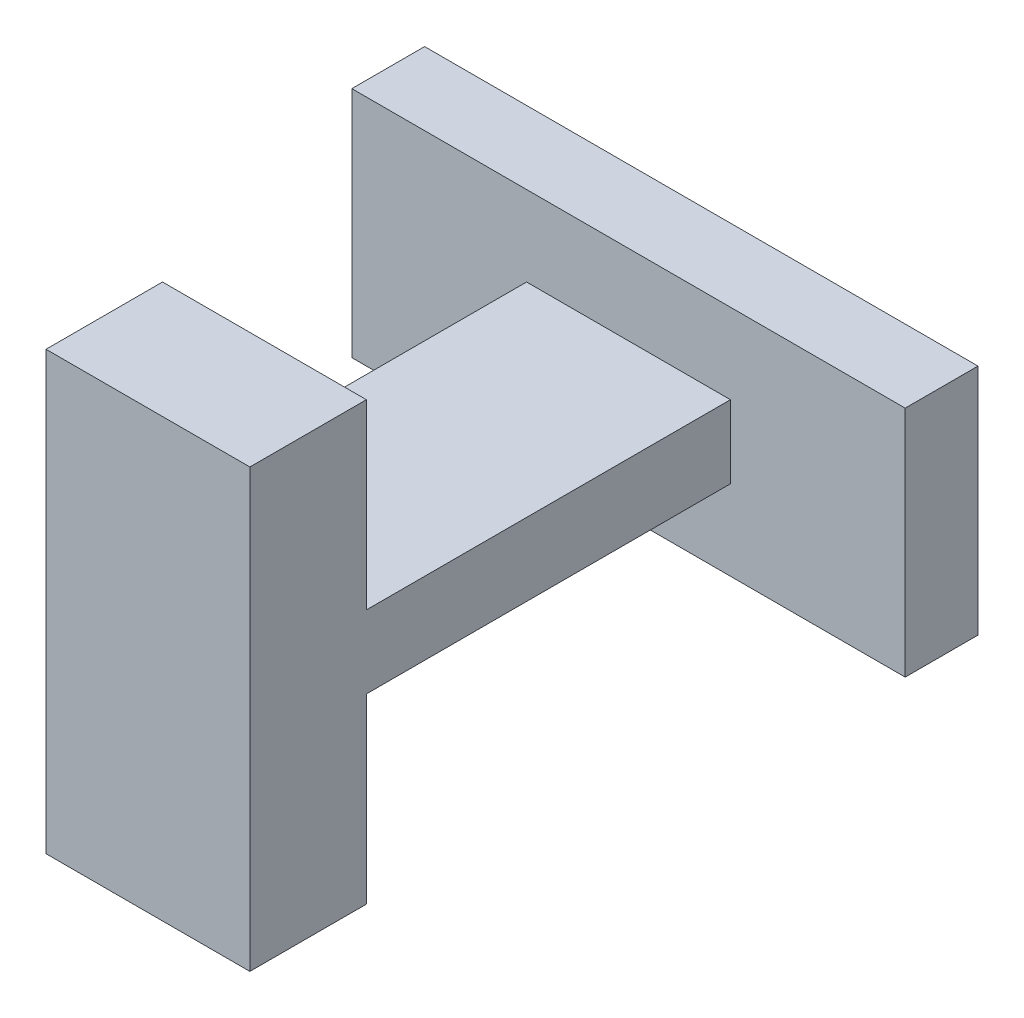
ISO-10303-21;
HEADER;
FILE_DESCRIPTION(('STEP AP214'),'2;1');
FILE_NAME('part.step','',(''),(''),'','','');
FILE_SCHEMA(('AUTOMOTIVE_DESIGN { 1 0 10303 214 1 1 1 1 }'));
ENDSEC;
DATA;
#1=APPLICATION_CONTEXT('core data for automotive mechanical design processes');
#2=APPLICATION_PROTOCOL_DEFINITION('international standard','automotive_design',2000,#1);
#3=PRODUCT_CONTEXT('',#1,'mechanical');
#4=PRODUCT('Part','Part','',(#3));
#5=PRODUCT_RELATED_PRODUCT_CATEGORY('part','',(#4));
#6=PRODUCT_DEFINITION_FORMATION('','',#4);
#7=PRODUCT_DEFINITION_CONTEXT('part definition',#1,'design');
#8=PRODUCT_DEFINITION('design','',#6,#7);
#9=PRODUCT_DEFINITION_SHAPE('','',#8);
#10=(LENGTH_UNIT() NAMED_UNIT(*) SI_UNIT(.MILLI.,.METRE.));
#11=(NAMED_UNIT(*) PLANE_ANGLE_UNIT() SI_UNIT($,.RADIAN.));
#12=(NAMED_UNIT(*) SI_UNIT($,.STERADIAN.) SOLID_ANGLE_UNIT());
#13=UNCERTAINTY_MEASURE_WITH_UNIT(LENGTH_MEASURE(1.E-05),#10,'distance_accuracy_value','');
#14=(GEOMETRIC_REPRESENTATION_CONTEXT(3) GLOBAL_UNCERTAINTY_ASSIGNED_CONTEXT((#13)) GLOBAL_UNIT_ASSIGNED_CONTEXT((#10,
#11,#12)) REPRESENTATION_CONTEXT('',''));
#15=CARTESIAN_POINT('',(0.,0.,0.));
#16=DIRECTION('',(0.,0.,1.));
#17=DIRECTION('',(1.,0.,0.));
#18=AXIS2_PLACEMENT_3D('',#15,#16,#17);
#19=CARTESIAN_POINT('',(0.,0.,5.));
#20=DIRECTION('',(0.,0.,-1.));
#21=DIRECTION('',(-1.,0.,0.));
#22=AXIS2_PLACEMENT_3D('',#19,#20,#21);
#23=PLANE('',#22);
#24=DIRECTION('',(0.,1.,0.));
#25=VECTOR('',#24,1.);
#26=CARTESIAN_POINT('',(19.,-8.,5.));
#27=LINE('',#26,#25);
#28=CARTESIAN_POINT('',(19.,-8.,5.));
#29=VERTEX_POINT('',#28);
#30=CARTESIAN_POINT('',(19.,8.,5.));
#31=VERTEX_POINT('',#30);
#32=EDGE_CURVE('E236',#29,#31,#27,.T.);
#33=ORIENTED_EDGE('',*,*,#32,.T.);
#34=DIRECTION('',(-1.,0.,0.));
#35=VECTOR('',#34,1.);
#36=CARTESIAN_POINT('',(-19.,8.,5.));
#37=LINE('',#36,#35);
#38=CARTESIAN_POINT('',(-19.,8.,5.));
#39=VERTEX_POINT('',#38);
#40=EDGE_CURVE('E247',#31,#39,#37,.T.);
#41=ORIENTED_EDGE('',*,*,#40,.T.);
#42=DIRECTION('',(0.,-1.,0.));
#43=VECTOR('',#42,1.);
#44=CARTESIAN_POINT('',(-19.,-8.,5.));
#45=LINE('',#44,#43);
#46=CARTESIAN_POINT('',(-19.,-8.,5.));
#47=VERTEX_POINT('',#46);
#48=EDGE_CURVE('E245',#39,#47,#45,.T.);
#49=ORIENTED_EDGE('',*,*,#48,.T.);
#50=DIRECTION('',(1.,0.,0.));
#51=VECTOR('',#50,1.);
#52=CARTESIAN_POINT('',(-19.,-8.,5.));
#53=LINE('',#52,#51);
#54=EDGE_CURVE('E233',#47,#29,#53,.T.);
#55=ORIENTED_EDGE('',*,*,#54,.T.);
#56=EDGE_LOOP('',(#33,#41,#49,#55));
#57=FACE_BOUND('',#56,.T.);
#58=DIRECTION('',(0.,1.,0.));
#59=VECTOR('',#58,1.);
#60=CARTESIAN_POINT('',(7.,-2.5,5.));
#61=LINE('',#60,#59);
#62=CARTESIAN_POINT('',(7.,-2.5,5.));
#63=VERTEX_POINT('',#62);
#64=CARTESIAN_POINT('',(7.,2.5,5.));
#65=VERTEX_POINT('',#64);
#66=EDGE_CURVE('E150',#63,#65,#61,.T.);
#67=ORIENTED_EDGE('',*,*,#66,.F.);
#68=DIRECTION('',(1.,0.,0.));
#69=VECTOR('',#68,1.);
#70=CARTESIAN_POINT('',(-7.,-2.5,5.));
#71=LINE('',#70,#69);
#72=CARTESIAN_POINT('',(-7.,-2.5,5.));
#73=VERTEX_POINT('',#72);
#74=EDGE_CURVE('E204',#73,#63,#71,.T.);
#75=ORIENTED_EDGE('',*,*,#74,.F.);
#76=DIRECTION('',(0.,-1.,0.));
#77=VECTOR('',#76,1.);
#78=CARTESIAN_POINT('',(-7.,-2.5,5.));
#79=LINE('',#78,#77);
#80=CARTESIAN_POINT('',(-7.,2.5,5.));
#81=VERTEX_POINT('',#80);
#82=EDGE_CURVE('E56',#81,#73,#79,.T.);
#83=ORIENTED_EDGE('',*,*,#82,.F.);
#84=DIRECTION('',(-1.,0.,0.));
#85=VECTOR('',#84,1.);
#86=CARTESIAN_POINT('',(-7.,2.5,5.));
#87=LINE('',#86,#85);
#88=EDGE_CURVE('E51',#65,#81,#87,.T.);
#89=ORIENTED_EDGE('',*,*,#88,.F.);
#90=EDGE_LOOP('',(#67,#75,#83,#89));
#91=FACE_BOUND('',#90,.T.);
#92=ADVANCED_FACE('F34',(#57,#91),#23,.F.);
#93=CARTESIAN_POINT('',(19.,-8.,5.));
#94=DIRECTION('',(-1.,0.,0.));
#95=DIRECTION('',(0.,0.,1.));
#96=AXIS2_PLACEMENT_3D('',#93,#94,#95);
#97=PLANE('',#96);
#98=DIRECTION('',(0.,1.,0.));
#99=VECTOR('',#98,1.);
#100=CARTESIAN_POINT('',(19.,-8.,0.));
#101=LINE('',#100,#99);
#102=CARTESIAN_POINT('',(19.,-8.,0.));
#103=VERTEX_POINT('',#102);
#104=CARTESIAN_POINT('',(19.,8.,0.));
#105=VERTEX_POINT('',#104);
#106=EDGE_CURVE('E241',#103,#105,#101,.T.);
#107=ORIENTED_EDGE('',*,*,#106,.T.);
#108=DIRECTION('',(0.,0.,-1.));
#109=VECTOR('',#108,1.);
#110=CARTESIAN_POINT('',(19.,8.,5.));
#111=LINE('',#110,#109);
#112=EDGE_CURVE('E11',#31,#105,#111,.T.);
#113=ORIENTED_EDGE('',*,*,#112,.F.);
#114=ORIENTED_EDGE('',*,*,#32,.F.);
#115=DIRECTION('',(0.,0.,-1.));
#116=VECTOR('',#115,1.);
#117=CARTESIAN_POINT('',(19.,-8.,5.));
#118=LINE('',#117,#116);
#119=EDGE_CURVE('E230',#29,#103,#118,.T.);
#120=ORIENTED_EDGE('',*,*,#119,.T.);
#121=EDGE_LOOP('',(#107,#113,#114,#120));
#122=FACE_BOUND('',#121,.T.);
#123=ADVANCED_FACE('F36',(#122),#97,.F.);
#124=CARTESIAN_POINT('',(-19.,8.,5.));
#125=DIRECTION('',(0.,-1.,0.));
#126=DIRECTION('',(0.,0.,-1.));
#127=AXIS2_PLACEMENT_3D('',#124,#125,#126);
#128=PLANE('',#127);
#129=DIRECTION('',(-1.,0.,0.));
#130=VECTOR('',#129,1.);
#131=CARTESIAN_POINT('',(-19.,8.,0.));
#132=LINE('',#131,#130);
#133=CARTESIAN_POINT('',(-19.,8.,0.));
#134=VERTEX_POINT('',#133);
#135=EDGE_CURVE('E239',#105,#134,#132,.T.);
#136=ORIENTED_EDGE('',*,*,#135,.T.);
#137=DIRECTION('',(0.,0.,-1.));
#138=VECTOR('',#137,1.);
#139=CARTESIAN_POINT('',(-19.,8.,5.));
#140=LINE('',#139,#138);
#141=EDGE_CURVE('E43',#39,#134,#140,.T.);
#142=ORIENTED_EDGE('',*,*,#141,.F.);
#143=ORIENTED_EDGE('',*,*,#40,.F.);
#144=ORIENTED_EDGE('',*,*,#112,.T.);
#145=EDGE_LOOP('',(#136,#142,#143,#144));
#146=FACE_BOUND('',#145,.T.);
#147=ADVANCED_FACE('F268',(#146),#128,.F.);
#148=CARTESIAN_POINT('',(-19.,-8.,5.));
#149=DIRECTION('',(1.,0.,0.));
#150=DIRECTION('',(0.,0.,-1.));
#151=AXIS2_PLACEMENT_3D('',#148,#149,#150);
#152=PLANE('',#151);
#153=DIRECTION('',(0.,-1.,0.));
#154=VECTOR('',#153,1.);
#155=CARTESIAN_POINT('',(-19.,-8.,0.));
#156=LINE('',#155,#154);
#157=CARTESIAN_POINT('',(-19.,-8.,0.));
#158=VERTEX_POINT('',#157);
#159=EDGE_CURVE('E237',#134,#158,#156,.T.);
#160=ORIENTED_EDGE('',*,*,#159,.T.);
#161=DIRECTION('',(0.,0.,-1.));
#162=VECTOR('',#161,1.);
#163=CARTESIAN_POINT('',(-19.,-8.,5.));
#164=LINE('',#163,#162);
#165=EDGE_CURVE('E227',#47,#158,#164,.T.);
#166=ORIENTED_EDGE('',*,*,#165,.F.);
#167=ORIENTED_EDGE('',*,*,#48,.F.);
#168=ORIENTED_EDGE('',*,*,#141,.T.);
#169=EDGE_LOOP('',(#160,#166,#167,#168));
#170=FACE_BOUND('',#169,.T.);
#171=ADVANCED_FACE('F280',(#170),#152,.F.);
#172=CARTESIAN_POINT('',(-19.,-8.,5.));
#173=DIRECTION('',(0.,1.,0.));
#174=DIRECTION('',(0.,0.,1.));
#175=AXIS2_PLACEMENT_3D('',#172,#173,#174);
#176=PLANE('',#175);
#177=DIRECTION('',(1.,0.,0.));
#178=VECTOR('',#177,1.);
#179=CARTESIAN_POINT('',(-19.,-8.,0.));
#180=LINE('',#179,#178);
#181=EDGE_CURVE('E234',#158,#103,#180,.T.);
#182=ORIENTED_EDGE('',*,*,#181,.T.);
#183=ORIENTED_EDGE('',*,*,#119,.F.);
#184=ORIENTED_EDGE('',*,*,#54,.F.);
#185=ORIENTED_EDGE('',*,*,#165,.T.);
#186=EDGE_LOOP('',(#182,#183,#184,#185));
#187=FACE_BOUND('',#186,.T.);
#188=ADVANCED_FACE('F276',(#187),#176,.F.);
#189=CARTESIAN_POINT('',(0.,0.,0.));
#190=DIRECTION('',(0.,0.,-1.));
#191=DIRECTION('',(-1.,0.,0.));
#192=AXIS2_PLACEMENT_3D('',#189,#190,#191);
#193=PLANE('',#192);
#194=ORIENTED_EDGE('',*,*,#106,.F.);
#195=ORIENTED_EDGE('',*,*,#181,.F.);
#196=ORIENTED_EDGE('',*,*,#159,.F.);
#197=ORIENTED_EDGE('',*,*,#135,.F.);
#198=EDGE_LOOP('',(#194,#195,#196,#197));
#199=FACE_BOUND('',#198,.T.);
#200=ADVANCED_FACE('F273',(#199),#193,.T.);
#201=CARTESIAN_POINT('',(7.,-2.5,30.));
#202=DIRECTION('',(-1.,0.,0.));
#203=DIRECTION('',(0.,0.,1.));
#204=AXIS2_PLACEMENT_3D('',#201,#202,#203);
#205=PLANE('',#204);
#206=ORIENTED_EDGE('',*,*,#66,.T.);
#207=DIRECTION('',(0.,0.,-1.));
#208=VECTOR('',#207,1.);
#209=CARTESIAN_POINT('',(7.,2.5,30.));
#210=LINE('',#209,#208);
#211=CARTESIAN_POINT('',(7.,2.5,30.));
#212=VERTEX_POINT('',#211);
#213=EDGE_CURVE('E223',#212,#65,#210,.T.);
#214=ORIENTED_EDGE('',*,*,#213,.F.);
#215=DIRECTION('',(0.,1.,0.));
#216=VECTOR('',#215,1.);
#217=CARTESIAN_POINT('',(7.,-15.,30.));
#218=LINE('',#217,#216);
#219=CARTESIAN_POINT('',(7.,15.,30.));
#220=VERTEX_POINT('',#219);
#221=EDGE_CURVE('E148',#212,#220,#218,.T.);
#222=ORIENTED_EDGE('',*,*,#221,.T.);
#223=DIRECTION('',(0.,0.,-1.));
#224=VECTOR('',#223,1.);
#225=CARTESIAN_POINT('',(7.,15.,38.));
#226=LINE('',#225,#224);
#227=CARTESIAN_POINT('',(7.,15.,38.));
#228=VERTEX_POINT('',#227);
#229=EDGE_CURVE('E127',#228,#220,#226,.T.);
#230=ORIENTED_EDGE('',*,*,#229,.F.);
#231=DIRECTION('',(0.,1.,0.));
#232=VECTOR('',#231,1.);
#233=CARTESIAN_POINT('',(7.,-15.,38.));
#234=LINE('',#233,#232);
#235=CARTESIAN_POINT('',(7.,-15.,38.));
#236=VERTEX_POINT('',#235);
#237=EDGE_CURVE('E133',#236,#228,#234,.T.);
#238=ORIENTED_EDGE('',*,*,#237,.F.);
#239=DIRECTION('',(0.,0.,-1.));
#240=VECTOR('',#239,1.);
#241=CARTESIAN_POINT('',(7.,-15.,38.));
#242=LINE('',#241,#240);
#243=CARTESIAN_POINT('',(7.,-15.,30.));
#244=VERTEX_POINT('',#243);
#245=EDGE_CURVE('E193',#236,#244,#242,.T.);
#246=ORIENTED_EDGE('',*,*,#245,.T.);
#247=CARTESIAN_POINT('',(7.,-2.5,30.));
#248=VERTEX_POINT('',#247);
#249=EDGE_CURVE('E157',#244,#248,#218,.T.);
#250=ORIENTED_EDGE('',*,*,#249,.T.);
#251=DIRECTION('',(0.,0.,-1.));
#252=VECTOR('',#251,1.);
#253=CARTESIAN_POINT('',(7.,-2.5,30.));
#254=LINE('',#253,#252);
#255=EDGE_CURVE('E198',#248,#63,#254,.T.);
#256=ORIENTED_EDGE('',*,*,#255,.T.);
#257=EDGE_LOOP('',(#206,#214,#222,#230,#238,#246,#250,#256));
#258=FACE_BOUND('',#257,.T.);
#259=ADVANCED_FACE('F145',(#258),#205,.F.);
#260=CARTESIAN_POINT('',(-7.,2.5,30.));
#261=DIRECTION('',(0.,-1.,0.));
#262=DIRECTION('',(0.,0.,-1.));
#263=AXIS2_PLACEMENT_3D('',#260,#261,#262);
#264=PLANE('',#263);
#265=ORIENTED_EDGE('',*,*,#88,.T.);
#266=DIRECTION('',(0.,0.,-1.));
#267=VECTOR('',#266,1.);
#268=CARTESIAN_POINT('',(-7.,2.5,30.));
#269=LINE('',#268,#267);
#270=CARTESIAN_POINT('',(-7.,2.5,30.));
#271=VERTEX_POINT('',#270);
#272=EDGE_CURVE('E213',#271,#81,#269,.T.);
#273=ORIENTED_EDGE('',*,*,#272,.F.);
#274=DIRECTION('',(-1.,0.,0.));
#275=VECTOR('',#274,1.);
#276=CARTESIAN_POINT('',(-7.,2.5,30.));
#277=LINE('',#276,#275);
#278=EDGE_CURVE('E202',#212,#271,#277,.T.);
#279=ORIENTED_EDGE('',*,*,#278,.F.);
#280=ORIENTED_EDGE('',*,*,#213,.T.);
#281=EDGE_LOOP('',(#265,#273,#279,#280));
#282=FACE_BOUND('',#281,.T.);
#283=ADVANCED_FACE('F251',(#282),#264,.F.);
#284=CARTESIAN_POINT('',(-7.,-2.5,30.));
#285=DIRECTION('',(1.,0.,0.));
#286=DIRECTION('',(0.,0.,-1.));
#287=AXIS2_PLACEMENT_3D('',#284,#285,#286);
#288=PLANE('',#287);
#289=ORIENTED_EDGE('',*,*,#82,.T.);
#290=DIRECTION('',(0.,0.,-1.));
#291=VECTOR('',#290,1.);
#292=CARTESIAN_POINT('',(-7.,-2.5,30.));
#293=LINE('',#292,#291);
#294=CARTESIAN_POINT('',(-7.,-2.5,30.));
#295=VERTEX_POINT('',#294);
#296=EDGE_CURVE('E186',#295,#73,#293,.T.);
#297=ORIENTED_EDGE('',*,*,#296,.F.);
#298=DIRECTION('',(0.,-1.,0.));
#299=VECTOR('',#298,1.);
#300=CARTESIAN_POINT('',(-7.,-15.,30.));
#301=LINE('',#300,#299);
#302=CARTESIAN_POINT('',(-7.,-15.,30.));
#303=VERTEX_POINT('',#302);
#304=EDGE_CURVE('E169',#295,#303,#301,.T.);
#305=ORIENTED_EDGE('',*,*,#304,.T.);
#306=DIRECTION('',(0.,0.,-1.));
#307=VECTOR('',#306,1.);
#308=CARTESIAN_POINT('',(-7.,-15.,38.));
#309=LINE('',#308,#307);
#310=CARTESIAN_POINT('',(-7.,-15.,38.));
#311=VERTEX_POINT('',#310);
#312=EDGE_CURVE('E153',#311,#303,#309,.T.);
#313=ORIENTED_EDGE('',*,*,#312,.F.);
#314=DIRECTION('',(0.,-1.,0.));
#315=VECTOR('',#314,1.);
#316=CARTESIAN_POINT('',(-7.,-15.,38.));
#317=LINE('',#316,#315);
#318=CARTESIAN_POINT('',(-7.,15.,38.));
#319=VERTEX_POINT('',#318);
#320=EDGE_CURVE('E132',#319,#311,#317,.T.);
#321=ORIENTED_EDGE('',*,*,#320,.F.);
#322=DIRECTION('',(0.,0.,-1.));
#323=VECTOR('',#322,1.);
#324=CARTESIAN_POINT('',(-7.,15.,38.));
#325=LINE('',#324,#323);
#326=CARTESIAN_POINT('',(-7.,15.,30.));
#327=VERTEX_POINT('',#326);
#328=EDGE_CURVE('E129',#319,#327,#325,.T.);
#329=ORIENTED_EDGE('',*,*,#328,.T.);
#330=EDGE_CURVE('E176',#327,#271,#301,.T.);
#331=ORIENTED_EDGE('',*,*,#330,.T.);
#332=ORIENTED_EDGE('',*,*,#272,.T.);
#333=EDGE_LOOP('',(#289,#297,#305,#313,#321,#329,#331,#332));
#334=FACE_BOUND('',#333,.T.);
#335=ADVANCED_FACE('F184',(#334),#288,.F.);
#336=CARTESIAN_POINT('',(-7.,-2.5,30.));
#337=DIRECTION('',(0.,1.,0.));
#338=DIRECTION('',(0.,0.,1.));
#339=AXIS2_PLACEMENT_3D('',#336,#337,#338);
#340=PLANE('',#339);
#341=ORIENTED_EDGE('',*,*,#74,.T.);
#342=ORIENTED_EDGE('',*,*,#255,.F.);
#343=DIRECTION('',(1.,0.,0.));
#344=VECTOR('',#343,1.);
#345=CARTESIAN_POINT('',(-7.,-2.5,30.));
#346=LINE('',#345,#344);
#347=EDGE_CURVE('E196',#295,#248,#346,.T.);
#348=ORIENTED_EDGE('',*,*,#347,.F.);
#349=ORIENTED_EDGE('',*,*,#296,.T.);
#350=EDGE_LOOP('',(#341,#342,#348,#349));
#351=FACE_BOUND('',#350,.T.);
#352=ADVANCED_FACE('F252',(#351),#340,.F.);
#353=CARTESIAN_POINT('',(0.,0.,30.));
#354=DIRECTION('',(0.,0.,-1.));
#355=DIRECTION('',(-1.,0.,0.));
#356=AXIS2_PLACEMENT_3D('',#353,#354,#355);
#357=PLANE('',#356);
#358=ORIENTED_EDGE('',*,*,#221,.F.);
#359=ORIENTED_EDGE('',*,*,#278,.T.);
#360=ORIENTED_EDGE('',*,*,#330,.F.);
#361=DIRECTION('',(-1.,0.,0.));
#362=VECTOR('',#361,1.);
#363=CARTESIAN_POINT('',(-7.,15.,30.));
#364=LINE('',#363,#362);
#365=EDGE_CURVE('E161',#220,#327,#364,.T.);
#366=ORIENTED_EDGE('',*,*,#365,.F.);
#367=EDGE_LOOP('',(#358,#359,#360,#366));
#368=FACE_BOUND('',#367,.T.);
#369=ADVANCED_FACE('F201',(#368),#357,.T.);
#370=CARTESIAN_POINT('',(-7.,15.,38.));
#371=DIRECTION('',(0.,-1.,0.));
#372=DIRECTION('',(0.,0.,-1.));
#373=AXIS2_PLACEMENT_3D('',#370,#371,#372);
#374=PLANE('',#373);
#375=ORIENTED_EDGE('',*,*,#365,.T.);
#376=ORIENTED_EDGE('',*,*,#328,.F.);
#377=DIRECTION('',(-1.,0.,0.));
#378=VECTOR('',#377,1.);
#379=CARTESIAN_POINT('',(-7.,15.,38.));
#380=LINE('',#379,#378);
#381=EDGE_CURVE('E123',#228,#319,#380,.T.);
#382=ORIENTED_EDGE('',*,*,#381,.F.);
#383=ORIENTED_EDGE('',*,*,#229,.T.);
#384=EDGE_LOOP('',(#375,#376,#382,#383));
#385=FACE_BOUND('',#384,.T.);
#386=ADVANCED_FACE('F125',(#385),#374,.F.);
#387=CARTESIAN_POINT('',(-7.,-15.,38.));
#388=DIRECTION('',(0.,1.,0.));
#389=DIRECTION('',(0.,0.,1.));
#390=AXIS2_PLACEMENT_3D('',#387,#388,#389);
#391=PLANE('',#390);
#392=DIRECTION('',(1.,0.,0.));
#393=VECTOR('',#392,1.);
#394=CARTESIAN_POINT('',(-7.,-15.,30.));
#395=LINE('',#394,#393);
#396=EDGE_CURVE('E142',#303,#244,#395,.T.);
#397=ORIENTED_EDGE('',*,*,#396,.T.);
#398=ORIENTED_EDGE('',*,*,#245,.F.);
#399=DIRECTION('',(1.,0.,0.));
#400=VECTOR('',#399,1.);
#401=CARTESIAN_POINT('',(-7.,-15.,38.));
#402=LINE('',#401,#400);
#403=EDGE_CURVE('E138',#311,#236,#402,.T.);
#404=ORIENTED_EDGE('',*,*,#403,.F.);
#405=ORIENTED_EDGE('',*,*,#312,.T.);
#406=EDGE_LOOP('',(#397,#398,#404,#405));
#407=FACE_BOUND('',#406,.T.);
#408=ADVANCED_FACE('F192',(#407),#391,.F.);
#409=CARTESIAN_POINT('',(0.,0.,38.));
#410=DIRECTION('',(0.,0.,-1.));
#411=DIRECTION('',(-1.,0.,0.));
#412=AXIS2_PLACEMENT_3D('',#409,#410,#411);
#413=PLANE('',#412);
#414=ORIENTED_EDGE('',*,*,#237,.T.);
#415=ORIENTED_EDGE('',*,*,#381,.T.);
#416=ORIENTED_EDGE('',*,*,#320,.T.);
#417=ORIENTED_EDGE('',*,*,#403,.T.);
#418=EDGE_LOOP('',(#414,#415,#416,#417));
#419=FACE_BOUND('',#418,.T.);
#420=ADVANCED_FACE('F136',(#419),#413,.F.);
#421=ORIENTED_EDGE('',*,*,#304,.F.);
#422=ORIENTED_EDGE('',*,*,#347,.T.);
#423=ORIENTED_EDGE('',*,*,#249,.F.);
#424=ORIENTED_EDGE('',*,*,#396,.F.);
#425=EDGE_LOOP('',(#421,#422,#423,#424));
#426=FACE_BOUND('',#425,.T.);
#427=ADVANCED_FACE('F195',(#426),#357,.T.);
#428=CLOSED_SHELL('',(#92,#123,#147,#171,#188,#200,#259,#283,#335,#352,#369,#386,#408,#420,#427));
#429=MANIFOLD_SOLID_BREP('B2',#428);
#430=ADVANCED_BREP_SHAPE_REPRESENTATION('',(#18,#429),#14);
#431=SHAPE_DEFINITION_REPRESENTATION(#9,#430);
ENDSEC;
END-ISO-10303-21;
